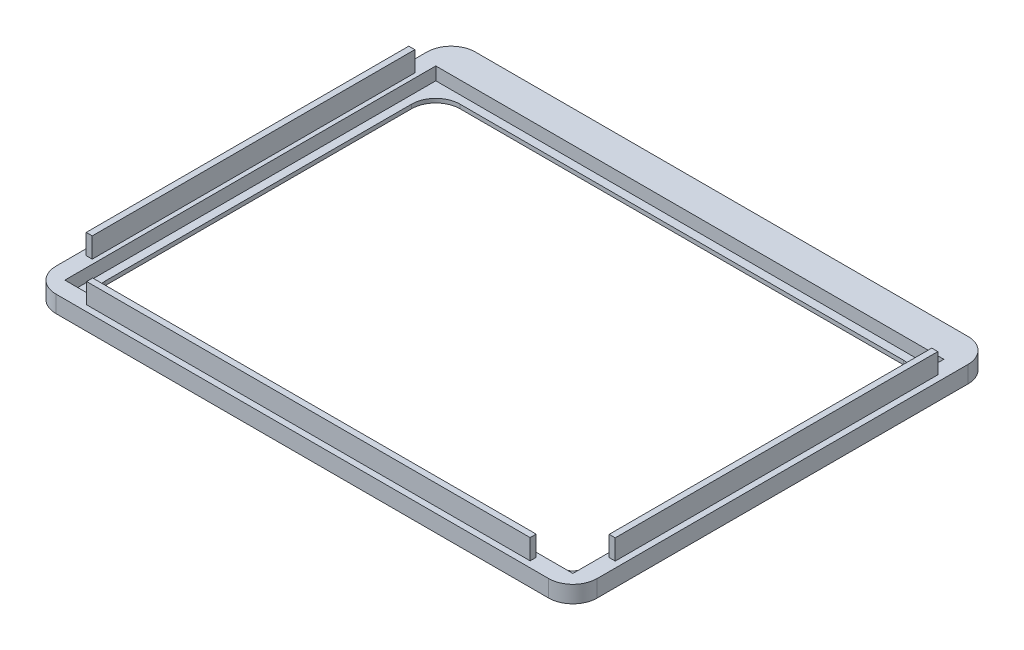
ISO-10303-21;
HEADER;
FILE_DESCRIPTION(('STEP AP214'),'2;1');
FILE_NAME('part.step','',(''),(''),'','','');
FILE_SCHEMA(('AUTOMOTIVE_DESIGN { 1 0 10303 214 1 1 1 1 }'));
ENDSEC;
DATA;
#1=APPLICATION_CONTEXT('core data for automotive mechanical design processes');
#2=APPLICATION_PROTOCOL_DEFINITION('international standard','automotive_design',2000,#1);
#3=PRODUCT_CONTEXT('',#1,'mechanical');
#4=PRODUCT('Part','Part','',(#3));
#5=PRODUCT_RELATED_PRODUCT_CATEGORY('part','',(#4));
#6=PRODUCT_DEFINITION_FORMATION('','',#4);
#7=PRODUCT_DEFINITION_CONTEXT('part definition',#1,'design');
#8=PRODUCT_DEFINITION('design','',#6,#7);
#9=PRODUCT_DEFINITION_SHAPE('','',#8);
#10=(LENGTH_UNIT() NAMED_UNIT(*) SI_UNIT(.MILLI.,.METRE.));
#11=(NAMED_UNIT(*) PLANE_ANGLE_UNIT() SI_UNIT($,.RADIAN.));
#12=(NAMED_UNIT(*) SI_UNIT($,.STERADIAN.) SOLID_ANGLE_UNIT());
#13=UNCERTAINTY_MEASURE_WITH_UNIT(LENGTH_MEASURE(1.E-05),#10,'distance_accuracy_value','');
#14=(GEOMETRIC_REPRESENTATION_CONTEXT(3) GLOBAL_UNCERTAINTY_ASSIGNED_CONTEXT((#13)) GLOBAL_UNIT_ASSIGNED_CONTEXT((#10,
#11,#12)) REPRESENTATION_CONTEXT('',''));
#15=CARTESIAN_POINT('',(0.,0.,0.));
#16=DIRECTION('',(0.,0.,1.));
#17=DIRECTION('',(1.,0.,0.));
#18=AXIS2_PLACEMENT_3D('',#15,#16,#17);
#19=CARTESIAN_POINT('',(3.,2.1,-49.));
#20=DIRECTION('',(0.,-1.,0.));
#21=DIRECTION('',(0.,0.,-1.));
#22=AXIS2_PLACEMENT_3D('',#19,#20,#21);
#23=PLANE('',#22);
#24=DIRECTION('',(0.,0.,1.));
#25=VECTOR('',#24,1.);
#26=CARTESIAN_POINT('',(65.6,2.1,-46.));
#27=LINE('',#26,#25);
#28=CARTESIAN_POINT('',(65.6,2.1,-46.));
#29=VERTEX_POINT('',#28);
#30=CARTESIAN_POINT('',(65.6,2.1,-6.));
#31=VERTEX_POINT('',#30);
#32=EDGE_CURVE('E319',#29,#31,#27,.T.);
#33=ORIENTED_EDGE('',*,*,#32,.F.);
#34=DIRECTION('',(-1.,0.,0.));
#35=VECTOR('',#34,1.);
#36=CARTESIAN_POINT('',(65.6,2.1,-46.));
#37=LINE('',#36,#35);
#38=CARTESIAN_POINT('',(66.35,2.1,-46.));
#39=VERTEX_POINT('',#38);
#40=EDGE_CURVE('E307',#39,#29,#37,.T.);
#41=ORIENTED_EDGE('',*,*,#40,.F.);
#42=DIRECTION('',(0.,0.,-1.));
#43=VECTOR('',#42,1.);
#44=CARTESIAN_POINT('',(66.35,2.1,-46.));
#45=LINE('',#44,#43);
#46=CARTESIAN_POINT('',(66.35,2.1,-6.));
#47=VERTEX_POINT('',#46);
#48=EDGE_CURVE('E313',#47,#39,#45,.T.);
#49=ORIENTED_EDGE('',*,*,#48,.F.);
#50=DIRECTION('',(1.,0.,0.));
#51=VECTOR('',#50,1.);
#52=CARTESIAN_POINT('',(65.6,2.1,-6.));
#53=LINE('',#52,#51);
#54=EDGE_CURVE('E316',#31,#47,#53,.T.);
#55=ORIENTED_EDGE('',*,*,#54,.F.);
#56=EDGE_LOOP('',(#33,#41,#49,#55));
#57=FACE_BOUND('',#56,.T.);
#58=CARTESIAN_POINT('',(3.,2.1,-49.));
#59=DIRECTION('',(0.,1.,0.));
#60=DIRECTION('',(0.,0.,-1.));
#61=AXIS2_PLACEMENT_3D('',#58,#59,#60);
#62=CIRCLE('',#61,3.);
#63=CARTESIAN_POINT('',(3.,2.1,-52.));
#64=VERTEX_POINT('',#63);
#65=CARTESIAN_POINT('',(0.,2.1,-49.));
#66=VERTEX_POINT('',#65);
#67=EDGE_CURVE('E503',#64,#66,#62,.T.);
#68=ORIENTED_EDGE('',*,*,#67,.T.);
#69=DIRECTION('',(0.,0.,1.));
#70=VECTOR('',#69,1.);
#71=CARTESIAN_POINT('',(0.,2.1,-3.));
#72=LINE('',#71,#70);
#73=CARTESIAN_POINT('',(0.,2.1,-3.));
#74=VERTEX_POINT('',#73);
#75=EDGE_CURVE('E509',#66,#74,#72,.T.);
#76=ORIENTED_EDGE('',*,*,#75,.T.);
#77=CARTESIAN_POINT('',(3.,2.1,-3.));
#78=DIRECTION('',(0.,1.,0.));
#79=DIRECTION('',(0.,0.,-1.));
#80=AXIS2_PLACEMENT_3D('',#77,#78,#79);
#81=CIRCLE('',#80,3.);
#82=CARTESIAN_POINT('',(3.,2.1,0.));
#83=VERTEX_POINT('',#82);
#84=EDGE_CURVE('E511',#74,#83,#81,.T.);
#85=ORIENTED_EDGE('',*,*,#84,.T.);
#86=DIRECTION('',(1.,0.,0.));
#87=VECTOR('',#86,1.);
#88=CARTESIAN_POINT('',(3.,2.1,0.));
#89=LINE('',#88,#87);
#90=CARTESIAN_POINT('',(64.1,2.1,0.));
#91=VERTEX_POINT('',#90);
#92=EDGE_CURVE('E517',#83,#91,#89,.T.);
#93=ORIENTED_EDGE('',*,*,#92,.T.);
#94=CARTESIAN_POINT('',(64.1,2.1,-3.));
#95=DIRECTION('',(0.,1.,0.));
#96=DIRECTION('',(0.,0.,1.));
#97=AXIS2_PLACEMENT_3D('',#94,#95,#96);
#98=CIRCLE('',#97,3.);
#99=CARTESIAN_POINT('',(67.1,2.1,-3.));
#100=VERTEX_POINT('',#99);
#101=EDGE_CURVE('E516',#91,#100,#98,.T.);
#102=ORIENTED_EDGE('',*,*,#101,.T.);
#103=DIRECTION('',(0.,0.,-1.));
#104=VECTOR('',#103,1.);
#105=CARTESIAN_POINT('',(67.1,2.1,-3.));
#106=LINE('',#105,#104);
#107=CARTESIAN_POINT('',(67.1,2.1,-49.));
#108=VERTEX_POINT('',#107);
#109=EDGE_CURVE('E525',#100,#108,#106,.T.);
#110=ORIENTED_EDGE('',*,*,#109,.T.);
#111=CARTESIAN_POINT('',(64.1,2.1,-49.));
#112=DIRECTION('',(0.,1.,0.));
#113=DIRECTION('',(0.,0.,-1.));
#114=AXIS2_PLACEMENT_3D('',#111,#112,#113);
#115=CIRCLE('',#114,3.00000000000001);
#116=CARTESIAN_POINT('',(64.1,2.1,-52.));
#117=VERTEX_POINT('',#116);
#118=EDGE_CURVE('E521',#108,#117,#115,.T.);
#119=ORIENTED_EDGE('',*,*,#118,.T.);
#120=DIRECTION('',(-1.,0.,0.));
#121=VECTOR('',#120,1.);
#122=CARTESIAN_POINT('',(3.,2.1,-52.));
#123=LINE('',#122,#121);
#124=EDGE_CURVE('E526',#117,#64,#123,.T.);
#125=ORIENTED_EDGE('',*,*,#124,.T.);
#126=EDGE_LOOP('',(#68,#76,#85,#93,#102,#110,#119,#125));
#127=FACE_BOUND('',#126,.T.);
#128=DIRECTION('',(1.,0.,0.));
#129=VECTOR('',#128,1.);
#130=CARTESIAN_POINT('',(2.05,2.1,-2.05));
#131=LINE('',#130,#129);
#132=CARTESIAN_POINT('',(2.05,2.1,-2.05));
#133=VERTEX_POINT('',#132);
#134=CARTESIAN_POINT('',(65.05,2.1,-2.05));
#135=VERTEX_POINT('',#134);
#136=EDGE_CURVE('E481',#133,#135,#131,.T.);
#137=ORIENTED_EDGE('',*,*,#136,.F.);
#138=DIRECTION('',(0.,0.,1.));
#139=VECTOR('',#138,1.);
#140=CARTESIAN_POINT('',(2.05,2.1,-2.05));
#141=LINE('',#140,#139);
#142=CARTESIAN_POINT('',(2.05,2.1,-48.05));
#143=VERTEX_POINT('',#142);
#144=EDGE_CURVE('E438',#143,#133,#141,.T.);
#145=ORIENTED_EDGE('',*,*,#144,.F.);
#146=DIRECTION('',(-1.,0.,0.));
#147=VECTOR('',#146,1.);
#148=CARTESIAN_POINT('',(2.05,2.1,-48.05));
#149=LINE('',#148,#147);
#150=CARTESIAN_POINT('',(65.05,2.1,-48.05));
#151=VERTEX_POINT('',#150);
#152=EDGE_CURVE('E467',#151,#143,#149,.T.);
#153=ORIENTED_EDGE('',*,*,#152,.F.);
#154=DIRECTION('',(0.,0.,-1.));
#155=VECTOR('',#154,1.);
#156=CARTESIAN_POINT('',(65.05,2.1,-2.05));
#157=LINE('',#156,#155);
#158=EDGE_CURVE('E484',#135,#151,#157,.T.);
#159=ORIENTED_EDGE('',*,*,#158,.F.);
#160=EDGE_LOOP('',(#137,#145,#153,#159));
#161=FACE_BOUND('',#160,.T.);
#162=DIRECTION('',(0.,0.,1.));
#163=VECTOR('',#162,1.);
#164=CARTESIAN_POINT('',(6.05,2.1,-1.5));
#165=LINE('',#164,#163);
#166=CARTESIAN_POINT('',(6.05,2.1,-1.5));
#167=VERTEX_POINT('',#166);
#168=CARTESIAN_POINT('',(6.05,2.1,-0.75));
#169=VERTEX_POINT('',#168);
#170=EDGE_CURVE('E294',#167,#169,#165,.T.);
#171=ORIENTED_EDGE('',*,*,#170,.F.);
#172=DIRECTION('',(-1.,0.,0.));
#173=VECTOR('',#172,1.);
#174=CARTESIAN_POINT('',(6.05,2.1,-1.5));
#175=LINE('',#174,#173);
#176=CARTESIAN_POINT('',(61.05,2.1,-1.5));
#177=VERTEX_POINT('',#176);
#178=EDGE_CURVE('E354',#177,#167,#175,.T.);
#179=ORIENTED_EDGE('',*,*,#178,.F.);
#180=DIRECTION('',(0.,0.,-1.));
#181=VECTOR('',#180,1.);
#182=CARTESIAN_POINT('',(61.05,2.1,-1.5));
#183=LINE('',#182,#181);
#184=CARTESIAN_POINT('',(61.05,2.1,-0.75));
#185=VERTEX_POINT('',#184);
#186=EDGE_CURVE('E357',#185,#177,#183,.T.);
#187=ORIENTED_EDGE('',*,*,#186,.F.);
#188=DIRECTION('',(1.,0.,0.));
#189=VECTOR('',#188,1.);
#190=CARTESIAN_POINT('',(6.05,2.1,-0.75));
#191=LINE('',#190,#189);
#192=EDGE_CURVE('E363',#169,#185,#191,.T.);
#193=ORIENTED_EDGE('',*,*,#192,.F.);
#194=EDGE_LOOP('',(#171,#179,#187,#193));
#195=FACE_BOUND('',#194,.T.);
#196=DIRECTION('',(0.,0.,1.));
#197=VECTOR('',#196,1.);
#198=CARTESIAN_POINT('',(0.750000000000005,2.1,-46.));
#199=LINE('',#198,#197);
#200=CARTESIAN_POINT('',(0.750000000000005,2.1,-46.));
#201=VERTEX_POINT('',#200);
#202=CARTESIAN_POINT('',(0.750000000000005,2.1,-6.));
#203=VERTEX_POINT('',#202);
#204=EDGE_CURVE('E62',#201,#203,#199,.T.);
#205=ORIENTED_EDGE('',*,*,#204,.F.);
#206=DIRECTION('',(-1.,0.,0.));
#207=VECTOR('',#206,1.);
#208=CARTESIAN_POINT('',(0.750000000000005,2.1,-46.));
#209=LINE('',#208,#207);
#210=CARTESIAN_POINT('',(1.50000000000001,2.1,-46.));
#211=VERTEX_POINT('',#210);
#212=EDGE_CURVE('E63',#211,#201,#209,.T.);
#213=ORIENTED_EDGE('',*,*,#212,.F.);
#214=DIRECTION('',(0.,0.,-1.));
#215=VECTOR('',#214,1.);
#216=CARTESIAN_POINT('',(1.50000000000001,2.1,-46.));
#217=LINE('',#216,#215);
#218=CARTESIAN_POINT('',(1.50000000000001,2.1,-6.));
#219=VERTEX_POINT('',#218);
#220=EDGE_CURVE('E919',#219,#211,#217,.T.);
#221=ORIENTED_EDGE('',*,*,#220,.F.);
#222=DIRECTION('',(1.,0.,0.));
#223=VECTOR('',#222,1.);
#224=CARTESIAN_POINT('',(0.750000000000005,2.1,-6.));
#225=LINE('',#224,#223);
#226=EDGE_CURVE('E927',#203,#219,#225,.T.);
#227=ORIENTED_EDGE('',*,*,#226,.F.);
#228=EDGE_LOOP('',(#205,#213,#221,#227));
#229=FACE_BOUND('',#228,.T.);
#230=ADVANCED_FACE('F44',(#57,#127,#161,#195,#229),#23,.F.);
#231=CARTESIAN_POINT('',(0.,0.5,0.));
#232=DIRECTION('',(0.,-1.,0.));
#233=DIRECTION('',(0.,0.,-1.));
#234=AXIS2_PLACEMENT_3D('',#231,#232,#233);
#235=PLANE('',#234);
#236=DIRECTION('',(0.,0.,1.));
#237=VECTOR('',#236,1.);
#238=CARTESIAN_POINT('',(2.05,0.5,-2.05));
#239=LINE('',#238,#237);
#240=CARTESIAN_POINT('',(2.05,0.5,-48.05));
#241=VERTEX_POINT('',#240);
#242=CARTESIAN_POINT('',(2.05,0.5,-2.05));
#243=VERTEX_POINT('',#242);
#244=EDGE_CURVE('E462',#241,#243,#239,.T.);
#245=ORIENTED_EDGE('',*,*,#244,.T.);
#246=DIRECTION('',(1.,0.,0.));
#247=VECTOR('',#246,1.);
#248=CARTESIAN_POINT('',(2.05,0.5,-2.05));
#249=LINE('',#248,#247);
#250=CARTESIAN_POINT('',(65.05,0.5,-2.05));
#251=VERTEX_POINT('',#250);
#252=EDGE_CURVE('E463',#243,#251,#249,.T.);
#253=ORIENTED_EDGE('',*,*,#252,.T.);
#254=DIRECTION('',(0.,0.,-1.));
#255=VECTOR('',#254,1.);
#256=CARTESIAN_POINT('',(65.05,0.5,-2.05));
#257=LINE('',#256,#255);
#258=CARTESIAN_POINT('',(65.05,0.5,-48.05));
#259=VERTEX_POINT('',#258);
#260=EDGE_CURVE('E466',#251,#259,#257,.T.);
#261=ORIENTED_EDGE('',*,*,#260,.T.);
#262=DIRECTION('',(-1.,0.,0.));
#263=VECTOR('',#262,1.);
#264=CARTESIAN_POINT('',(2.05,0.5,-48.05));
#265=LINE('',#264,#263);
#266=EDGE_CURVE('E475',#259,#241,#265,.T.);
#267=ORIENTED_EDGE('',*,*,#266,.T.);
#268=EDGE_LOOP('',(#245,#253,#261,#267));
#269=FACE_BOUND('',#268,.T.);
#270=CARTESIAN_POINT('',(6.05,0.5,-44.05));
#271=DIRECTION('',(0.,1.,0.));
#272=DIRECTION('',(0.,0.,1.));
#273=AXIS2_PLACEMENT_3D('',#270,#271,#272);
#274=CIRCLE('',#273,3.);
#275=CARTESIAN_POINT('',(6.05,0.5,-47.05));
#276=VERTEX_POINT('',#275);
#277=CARTESIAN_POINT('',(3.05,0.5,-44.05));
#278=VERTEX_POINT('',#277);
#279=EDGE_CURVE('E279',#276,#278,#274,.T.);
#280=ORIENTED_EDGE('',*,*,#279,.F.);
#281=DIRECTION('',(1.,0.,0.));
#282=VECTOR('',#281,1.);
#283=CARTESIAN_POINT('',(6.05,0.5,-47.05));
#284=LINE('',#283,#282);
#285=CARTESIAN_POINT('',(61.05,0.5,-47.05));
#286=VERTEX_POINT('',#285);
#287=EDGE_CURVE('E383',#276,#286,#284,.T.);
#288=ORIENTED_EDGE('',*,*,#287,.T.);
#289=CARTESIAN_POINT('',(61.05,0.5,-44.05));
#290=DIRECTION('',(0.,-1.,0.));
#291=DIRECTION('',(0.,0.,-1.));
#292=AXIS2_PLACEMENT_3D('',#289,#290,#291);
#293=CIRCLE('',#292,3.);
#294=CARTESIAN_POINT('',(64.05,0.5,-44.05));
#295=VERTEX_POINT('',#294);
#296=EDGE_CURVE('E427',#286,#295,#293,.T.);
#297=ORIENTED_EDGE('',*,*,#296,.T.);
#298=DIRECTION('',(0.,0.,1.));
#299=VECTOR('',#298,1.);
#300=CARTESIAN_POINT('',(64.05,0.5,-44.05));
#301=LINE('',#300,#299);
#302=CARTESIAN_POINT('',(64.05,0.5,-6.05));
#303=VERTEX_POINT('',#302);
#304=EDGE_CURVE('E422',#295,#303,#301,.T.);
#305=ORIENTED_EDGE('',*,*,#304,.T.);
#306=CARTESIAN_POINT('',(61.05,0.5,-6.05));
#307=DIRECTION('',(0.,1.,0.));
#308=DIRECTION('',(0.,0.,1.));
#309=AXIS2_PLACEMENT_3D('',#306,#307,#308);
#310=CIRCLE('',#309,3.);
#311=CARTESIAN_POINT('',(61.05,0.5,-3.05000000000001));
#312=VERTEX_POINT('',#311);
#313=EDGE_CURVE('E423',#312,#303,#310,.T.);
#314=ORIENTED_EDGE('',*,*,#313,.F.);
#315=DIRECTION('',(1.,0.,0.));
#316=VECTOR('',#315,1.);
#317=CARTESIAN_POINT('',(6.05,0.5,-3.05));
#318=LINE('',#317,#316);
#319=CARTESIAN_POINT('',(6.05,0.5,-3.05));
#320=VERTEX_POINT('',#319);
#321=EDGE_CURVE('E417',#320,#312,#318,.T.);
#322=ORIENTED_EDGE('',*,*,#321,.F.);
#323=CARTESIAN_POINT('',(6.05,0.5,-6.05));
#324=DIRECTION('',(0.,1.,0.));
#325=DIRECTION('',(0.,0.,1.));
#326=AXIS2_PLACEMENT_3D('',#323,#324,#325);
#327=CIRCLE('',#326,3.);
#328=CARTESIAN_POINT('',(3.05,0.5,-6.05));
#329=VERTEX_POINT('',#328);
#330=EDGE_CURVE('E413',#329,#320,#327,.T.);
#331=ORIENTED_EDGE('',*,*,#330,.F.);
#332=DIRECTION('',(0.,0.,1.));
#333=VECTOR('',#332,1.);
#334=CARTESIAN_POINT('',(3.05,0.5,-44.05));
#335=LINE('',#334,#333);
#336=EDGE_CURVE('E285',#278,#329,#335,.T.);
#337=ORIENTED_EDGE('',*,*,#336,.F.);
#338=EDGE_LOOP('',(#280,#288,#297,#305,#314,#322,#331,#337));
#339=FACE_BOUND('',#338,.T.);
#340=ADVANCED_FACE('F626',(#269,#339),#235,.F.);
#341=CARTESIAN_POINT('',(3.,2.1,-49.));
#342=DIRECTION('',(0.,-1.,0.));
#343=DIRECTION('',(0.,0.,-1.));
#344=AXIS2_PLACEMENT_3D('',#341,#342,#343);
#345=CYLINDRICAL_SURFACE('',#344,3.);
#346=CARTESIAN_POINT('',(3.,0.,-49.));
#347=DIRECTION('',(0.,1.,0.));
#348=DIRECTION('',(0.,0.,-1.));
#349=AXIS2_PLACEMENT_3D('',#346,#347,#348);
#350=CIRCLE('',#349,3.);
#351=CARTESIAN_POINT('',(3.,0.,-52.));
#352=VERTEX_POINT('',#351);
#353=CARTESIAN_POINT('',(0.,0.,-49.));
#354=VERTEX_POINT('',#353);
#355=EDGE_CURVE('E494',#352,#354,#350,.T.);
#356=ORIENTED_EDGE('',*,*,#355,.T.);
#357=DIRECTION('',(0.,-1.,0.));
#358=VECTOR('',#357,1.);
#359=CARTESIAN_POINT('',(0.,2.1,-49.));
#360=LINE('',#359,#358);
#361=EDGE_CURVE('E11',#66,#354,#360,.T.);
#362=ORIENTED_EDGE('',*,*,#361,.F.);
#363=ORIENTED_EDGE('',*,*,#67,.F.);
#364=DIRECTION('',(0.,-1.,0.));
#365=VECTOR('',#364,1.);
#366=CARTESIAN_POINT('',(3.,2.1,-52.));
#367=LINE('',#366,#365);
#368=EDGE_CURVE('E533',#64,#352,#367,.T.);
#369=ORIENTED_EDGE('',*,*,#368,.T.);
#370=EDGE_LOOP('',(#356,#362,#363,#369));
#371=FACE_BOUND('',#370,.T.);
#372=ADVANCED_FACE('F50',(#371),#345,.T.);
#373=CARTESIAN_POINT('',(0.,2.1,-3.));
#374=DIRECTION('',(1.,0.,0.));
#375=DIRECTION('',(0.,0.,-1.));
#376=AXIS2_PLACEMENT_3D('',#373,#374,#375);
#377=PLANE('',#376);
#378=DIRECTION('',(0.,0.,1.));
#379=VECTOR('',#378,1.);
#380=CARTESIAN_POINT('',(0.,0.,-3.));
#381=LINE('',#380,#379);
#382=CARTESIAN_POINT('',(0.,0.,-3.));
#383=VERTEX_POINT('',#382);
#384=EDGE_CURVE('E532',#354,#383,#381,.T.);
#385=ORIENTED_EDGE('',*,*,#384,.T.);
#386=DIRECTION('',(0.,-1.,0.));
#387=VECTOR('',#386,1.);
#388=CARTESIAN_POINT('',(0.,2.1,-3.));
#389=LINE('',#388,#387);
#390=EDGE_CURVE('E53',#74,#383,#389,.T.);
#391=ORIENTED_EDGE('',*,*,#390,.F.);
#392=ORIENTED_EDGE('',*,*,#75,.F.);
#393=ORIENTED_EDGE('',*,*,#361,.T.);
#394=EDGE_LOOP('',(#385,#391,#392,#393));
#395=FACE_BOUND('',#394,.T.);
#396=ADVANCED_FACE('F607',(#395),#377,.F.);
#397=CARTESIAN_POINT('',(3.,2.1,-3.));
#398=DIRECTION('',(0.,-1.,0.));
#399=DIRECTION('',(0.,0.,-1.));
#400=AXIS2_PLACEMENT_3D('',#397,#398,#399);
#401=CYLINDRICAL_SURFACE('',#400,3.);
#402=CARTESIAN_POINT('',(3.,0.,-3.));
#403=DIRECTION('',(0.,1.,0.));
#404=DIRECTION('',(0.,0.,-1.));
#405=AXIS2_PLACEMENT_3D('',#402,#403,#404);
#406=CIRCLE('',#405,3.);
#407=CARTESIAN_POINT('',(3.,0.,0.));
#408=VERTEX_POINT('',#407);
#409=EDGE_CURVE('E538',#383,#408,#406,.T.);
#410=ORIENTED_EDGE('',*,*,#409,.T.);
#411=DIRECTION('',(0.,-1.,0.));
#412=VECTOR('',#411,1.);
#413=CARTESIAN_POINT('',(3.,2.1,0.));
#414=LINE('',#413,#412);
#415=EDGE_CURVE('E571',#83,#408,#414,.T.);
#416=ORIENTED_EDGE('',*,*,#415,.F.);
#417=ORIENTED_EDGE('',*,*,#84,.F.);
#418=ORIENTED_EDGE('',*,*,#390,.T.);
#419=EDGE_LOOP('',(#410,#416,#417,#418));
#420=FACE_BOUND('',#419,.T.);
#421=ADVANCED_FACE('F581',(#420),#401,.T.);
#422=CARTESIAN_POINT('',(3.,2.1,0.));
#423=DIRECTION('',(0.,0.,-1.));
#424=DIRECTION('',(-1.,0.,0.));
#425=AXIS2_PLACEMENT_3D('',#422,#423,#424);
#426=PLANE('',#425);
#427=DIRECTION('',(1.,0.,0.));
#428=VECTOR('',#427,1.);
#429=CARTESIAN_POINT('',(3.,0.,0.));
#430=LINE('',#429,#428);
#431=CARTESIAN_POINT('',(64.1,0.,0.));
#432=VERTEX_POINT('',#431);
#433=EDGE_CURVE('E541',#408,#432,#430,.T.);
#434=ORIENTED_EDGE('',*,*,#433,.T.);
#435=DIRECTION('',(0.,-1.,0.));
#436=VECTOR('',#435,1.);
#437=CARTESIAN_POINT('',(64.1,2.1,0.));
#438=LINE('',#437,#436);
#439=EDGE_CURVE('E568',#91,#432,#438,.T.);
#440=ORIENTED_EDGE('',*,*,#439,.F.);
#441=ORIENTED_EDGE('',*,*,#92,.F.);
#442=ORIENTED_EDGE('',*,*,#415,.T.);
#443=EDGE_LOOP('',(#434,#440,#441,#442));
#444=FACE_BOUND('',#443,.T.);
#445=ADVANCED_FACE('F592',(#444),#426,.F.);
#446=CARTESIAN_POINT('',(64.1,2.1,-3.));
#447=DIRECTION('',(0.,-1.,0.));
#448=DIRECTION('',(0.,0.,-1.));
#449=AXIS2_PLACEMENT_3D('',#446,#447,#448);
#450=CYLINDRICAL_SURFACE('',#449,3.);
#451=CARTESIAN_POINT('',(64.1,0.,-3.));
#452=DIRECTION('',(0.,1.,0.));
#453=DIRECTION('',(0.,0.,1.));
#454=AXIS2_PLACEMENT_3D('',#451,#452,#453);
#455=CIRCLE('',#454,3.);
#456=CARTESIAN_POINT('',(67.1,0.,-3.));
#457=VERTEX_POINT('',#456);
#458=EDGE_CURVE('E542',#432,#457,#455,.T.);
#459=ORIENTED_EDGE('',*,*,#458,.T.);
#460=DIRECTION('',(0.,-1.,0.));
#461=VECTOR('',#460,1.);
#462=CARTESIAN_POINT('',(67.1,2.1,-3.));
#463=LINE('',#462,#461);
#464=EDGE_CURVE('E567',#100,#457,#463,.T.);
#465=ORIENTED_EDGE('',*,*,#464,.F.);
#466=ORIENTED_EDGE('',*,*,#101,.F.);
#467=ORIENTED_EDGE('',*,*,#439,.T.);
#468=EDGE_LOOP('',(#459,#465,#466,#467));
#469=FACE_BOUND('',#468,.T.);
#470=ADVANCED_FACE('F598',(#469),#450,.T.);
#471=CARTESIAN_POINT('',(67.1,2.1,-3.));
#472=DIRECTION('',(-1.,0.,0.));
#473=DIRECTION('',(0.,0.,1.));
#474=AXIS2_PLACEMENT_3D('',#471,#472,#473);
#475=PLANE('',#474);
#476=DIRECTION('',(0.,0.,-1.));
#477=VECTOR('',#476,1.);
#478=CARTESIAN_POINT('',(67.1,0.,-3.));
#479=LINE('',#478,#477);
#480=CARTESIAN_POINT('',(67.1,0.,-49.));
#481=VERTEX_POINT('',#480);
#482=EDGE_CURVE('E550',#457,#481,#479,.T.);
#483=ORIENTED_EDGE('',*,*,#482,.T.);
#484=DIRECTION('',(0.,-1.,0.));
#485=VECTOR('',#484,1.);
#486=CARTESIAN_POINT('',(67.1,2.1,-49.));
#487=LINE('',#486,#485);
#488=EDGE_CURVE('E565',#108,#481,#487,.T.);
#489=ORIENTED_EDGE('',*,*,#488,.F.);
#490=ORIENTED_EDGE('',*,*,#109,.F.);
#491=ORIENTED_EDGE('',*,*,#464,.T.);
#492=EDGE_LOOP('',(#483,#489,#490,#491));
#493=FACE_BOUND('',#492,.T.);
#494=ADVANCED_FACE('F619',(#493),#475,.F.);
#495=CARTESIAN_POINT('',(64.1,2.1,-49.));
#496=DIRECTION('',(0.,-1.,0.));
#497=DIRECTION('',(0.,0.,-1.));
#498=AXIS2_PLACEMENT_3D('',#495,#496,#497);
#499=CYLINDRICAL_SURFACE('',#498,3.00000000000001);
#500=CARTESIAN_POINT('',(64.1,0.,-49.));
#501=DIRECTION('',(0.,1.,0.));
#502=DIRECTION('',(0.,0.,-1.));
#503=AXIS2_PLACEMENT_3D('',#500,#501,#502);
#504=CIRCLE('',#503,3.00000000000001);
#505=CARTESIAN_POINT('',(64.1,0.,-52.));
#506=VERTEX_POINT('',#505);
#507=EDGE_CURVE('E549',#481,#506,#504,.T.);
#508=ORIENTED_EDGE('',*,*,#507,.T.);
#509=DIRECTION('',(0.,-1.,0.));
#510=VECTOR('',#509,1.);
#511=CARTESIAN_POINT('',(64.1,2.1,-52.));
#512=LINE('',#511,#510);
#513=EDGE_CURVE('E560',#117,#506,#512,.T.);
#514=ORIENTED_EDGE('',*,*,#513,.F.);
#515=ORIENTED_EDGE('',*,*,#118,.F.);
#516=ORIENTED_EDGE('',*,*,#488,.T.);
#517=EDGE_LOOP('',(#508,#514,#515,#516));
#518=FACE_BOUND('',#517,.T.);
#519=ADVANCED_FACE('F620',(#518),#499,.T.);
#520=CARTESIAN_POINT('',(3.,2.1,-52.));
#521=DIRECTION('',(0.,0.,1.));
#522=DIRECTION('',(1.,0.,0.));
#523=AXIS2_PLACEMENT_3D('',#520,#521,#522);
#524=PLANE('',#523);
#525=DIRECTION('',(-1.,0.,0.));
#526=VECTOR('',#525,1.);
#527=CARTESIAN_POINT('',(3.,0.,-52.));
#528=LINE('',#527,#526);
#529=EDGE_CURVE('E506',#506,#352,#528,.T.);
#530=ORIENTED_EDGE('',*,*,#529,.T.);
#531=ORIENTED_EDGE('',*,*,#368,.F.);
#532=ORIENTED_EDGE('',*,*,#124,.F.);
#533=ORIENTED_EDGE('',*,*,#513,.T.);
#534=EDGE_LOOP('',(#530,#531,#532,#533));
#535=FACE_BOUND('',#534,.T.);
#536=ADVANCED_FACE('F614',(#535),#524,.F.);
#537=CARTESIAN_POINT('',(3.,0.,-49.));
#538=DIRECTION('',(0.,-1.,0.));
#539=DIRECTION('',(0.,0.,-1.));
#540=AXIS2_PLACEMENT_3D('',#537,#538,#539);
#541=PLANE('',#540);
#542=CARTESIAN_POINT('',(6.05,0.,-44.05));
#543=DIRECTION('',(0.,1.,0.));
#544=DIRECTION('',(0.,0.,1.));
#545=AXIS2_PLACEMENT_3D('',#542,#543,#544);
#546=CIRCLE('',#545,3.);
#547=CARTESIAN_POINT('',(6.05,0.,-47.05));
#548=VERTEX_POINT('',#547);
#549=CARTESIAN_POINT('',(3.05,0.,-44.05));
#550=VERTEX_POINT('',#549);
#551=EDGE_CURVE('E377',#548,#550,#546,.T.);
#552=ORIENTED_EDGE('',*,*,#551,.T.);
#553=DIRECTION('',(0.,0.,1.));
#554=VECTOR('',#553,1.);
#555=CARTESIAN_POINT('',(3.05,0.,-44.05));
#556=LINE('',#555,#554);
#557=CARTESIAN_POINT('',(3.05,0.,-6.05000000000001));
#558=VERTEX_POINT('',#557);
#559=EDGE_CURVE('E382',#550,#558,#556,.T.);
#560=ORIENTED_EDGE('',*,*,#559,.T.);
#561=CARTESIAN_POINT('',(6.05,0.,-6.05));
#562=DIRECTION('',(0.,1.,0.));
#563=DIRECTION('',(0.,0.,1.));
#564=AXIS2_PLACEMENT_3D('',#561,#562,#563);
#565=CIRCLE('',#564,3.);
#566=CARTESIAN_POINT('',(6.05,0.,-3.05));
#567=VERTEX_POINT('',#566);
#568=EDGE_CURVE('E389',#558,#567,#565,.T.);
#569=ORIENTED_EDGE('',*,*,#568,.T.);
#570=DIRECTION('',(1.,0.,0.));
#571=VECTOR('',#570,1.);
#572=CARTESIAN_POINT('',(6.05,0.,-3.05));
#573=LINE('',#572,#571);
#574=CARTESIAN_POINT('',(61.05,0.,-3.05000000000001));
#575=VERTEX_POINT('',#574);
#576=EDGE_CURVE('E394',#567,#575,#573,.T.);
#577=ORIENTED_EDGE('',*,*,#576,.T.);
#578=CARTESIAN_POINT('',(61.05,0.,-6.05));
#579=DIRECTION('',(0.,1.,0.));
#580=DIRECTION('',(0.,0.,1.));
#581=AXIS2_PLACEMENT_3D('',#578,#579,#580);
#582=CIRCLE('',#581,3.);
#583=CARTESIAN_POINT('',(64.05,0.,-6.05));
#584=VERTEX_POINT('',#583);
#585=EDGE_CURVE('E397',#575,#584,#582,.T.);
#586=ORIENTED_EDGE('',*,*,#585,.T.);
#587=DIRECTION('',(0.,0.,1.));
#588=VECTOR('',#587,1.);
#589=CARTESIAN_POINT('',(64.05,0.,-44.05));
#590=LINE('',#589,#588);
#591=CARTESIAN_POINT('',(64.05,0.,-44.05));
#592=VERTEX_POINT('',#591);
#593=EDGE_CURVE('E396',#592,#584,#590,.T.);
#594=ORIENTED_EDGE('',*,*,#593,.F.);
#595=CARTESIAN_POINT('',(61.05,0.,-44.05));
#596=DIRECTION('',(0.,-1.,0.));
#597=DIRECTION('',(0.,0.,-1.));
#598=AXIS2_PLACEMENT_3D('',#595,#596,#597);
#599=CIRCLE('',#598,3.);
#600=CARTESIAN_POINT('',(61.05,0.,-47.05));
#601=VERTEX_POINT('',#600);
#602=EDGE_CURVE('E401',#601,#592,#599,.T.);
#603=ORIENTED_EDGE('',*,*,#602,.F.);
#604=DIRECTION('',(1.,0.,0.));
#605=VECTOR('',#604,1.);
#606=CARTESIAN_POINT('',(6.05,0.,-47.05));
#607=LINE('',#606,#605);
#608=EDGE_CURVE('E407',#548,#601,#607,.T.);
#609=ORIENTED_EDGE('',*,*,#608,.F.);
#610=EDGE_LOOP('',(#552,#560,#569,#577,#586,#594,#603,#609));
#611=FACE_BOUND('',#610,.T.);
#612=ORIENTED_EDGE('',*,*,#355,.F.);
#613=ORIENTED_EDGE('',*,*,#529,.F.);
#614=ORIENTED_EDGE('',*,*,#507,.F.);
#615=ORIENTED_EDGE('',*,*,#482,.F.);
#616=ORIENTED_EDGE('',*,*,#458,.F.);
#617=ORIENTED_EDGE('',*,*,#433,.F.);
#618=ORIENTED_EDGE('',*,*,#409,.F.);
#619=ORIENTED_EDGE('',*,*,#384,.F.);
#620=EDGE_LOOP('',(#612,#613,#614,#615,#616,#617,#618,#619));
#621=FACE_BOUND('',#620,.T.);
#622=ADVANCED_FACE('F589',(#611,#621),#541,.T.);
#623=CARTESIAN_POINT('',(2.05,0.5,-2.05));
#624=DIRECTION('',(-1.,0.,0.));
#625=DIRECTION('',(0.,0.,1.));
#626=AXIS2_PLACEMENT_3D('',#623,#624,#625);
#627=PLANE('',#626);
#628=ORIENTED_EDGE('',*,*,#144,.T.);
#629=DIRECTION('',(0.,1.,0.));
#630=VECTOR('',#629,1.);
#631=CARTESIAN_POINT('',(2.05,0.5,-2.05));
#632=LINE('',#631,#630);
#633=EDGE_CURVE('E476',#243,#133,#632,.T.);
#634=ORIENTED_EDGE('',*,*,#633,.F.);
#635=ORIENTED_EDGE('',*,*,#244,.F.);
#636=DIRECTION('',(0.,1.,0.));
#637=VECTOR('',#636,1.);
#638=CARTESIAN_POINT('',(2.05,0.5,-48.05));
#639=LINE('',#638,#637);
#640=EDGE_CURVE('E495',#241,#143,#639,.T.);
#641=ORIENTED_EDGE('',*,*,#640,.T.);
#642=EDGE_LOOP('',(#628,#634,#635,#641));
#643=FACE_BOUND('',#642,.T.);
#644=ADVANCED_FACE('F643',(#643),#627,.F.);
#645=CARTESIAN_POINT('',(2.05,0.5,-48.05));
#646=DIRECTION('',(0.,0.,-1.));
#647=DIRECTION('',(-1.,0.,0.));
#648=AXIS2_PLACEMENT_3D('',#645,#646,#647);
#649=PLANE('',#648);
#650=ORIENTED_EDGE('',*,*,#152,.T.);
#651=ORIENTED_EDGE('',*,*,#640,.F.);
#652=ORIENTED_EDGE('',*,*,#266,.F.);
#653=DIRECTION('',(0.,1.,0.));
#654=VECTOR('',#653,1.);
#655=CARTESIAN_POINT('',(65.05,0.5,-48.05));
#656=LINE('',#655,#654);
#657=EDGE_CURVE('E497',#259,#151,#656,.T.);
#658=ORIENTED_EDGE('',*,*,#657,.T.);
#659=EDGE_LOOP('',(#650,#651,#652,#658));
#660=FACE_BOUND('',#659,.T.);
#661=ADVANCED_FACE('F658',(#660),#649,.F.);
#662=CARTESIAN_POINT('',(65.05,0.5,-2.05));
#663=DIRECTION('',(1.,0.,0.));
#664=DIRECTION('',(0.,0.,-1.));
#665=AXIS2_PLACEMENT_3D('',#662,#663,#664);
#666=PLANE('',#665);
#667=ORIENTED_EDGE('',*,*,#158,.T.);
#668=ORIENTED_EDGE('',*,*,#657,.F.);
#669=ORIENTED_EDGE('',*,*,#260,.F.);
#670=DIRECTION('',(0.,1.,0.));
#671=VECTOR('',#670,1.);
#672=CARTESIAN_POINT('',(65.05,0.5,-2.05));
#673=LINE('',#672,#671);
#674=EDGE_CURVE('E496',#251,#135,#673,.T.);
#675=ORIENTED_EDGE('',*,*,#674,.T.);
#676=EDGE_LOOP('',(#667,#668,#669,#675));
#677=FACE_BOUND('',#676,.T.);
#678=ADVANCED_FACE('F669',(#677),#666,.F.);
#679=CARTESIAN_POINT('',(2.05,0.5,-2.05));
#680=DIRECTION('',(0.,0.,1.));
#681=DIRECTION('',(1.,0.,0.));
#682=AXIS2_PLACEMENT_3D('',#679,#680,#681);
#683=PLANE('',#682);
#684=ORIENTED_EDGE('',*,*,#136,.T.);
#685=ORIENTED_EDGE('',*,*,#674,.F.);
#686=ORIENTED_EDGE('',*,*,#252,.F.);
#687=ORIENTED_EDGE('',*,*,#633,.T.);
#688=EDGE_LOOP('',(#684,#685,#686,#687));
#689=FACE_BOUND('',#688,.T.);
#690=ADVANCED_FACE('F677',(#689),#683,.F.);
#691=CARTESIAN_POINT('',(6.05,0.,-44.05));
#692=DIRECTION('',(0.,1.,0.));
#693=DIRECTION('',(0.,0.,1.));
#694=AXIS2_PLACEMENT_3D('',#691,#692,#693);
#695=CYLINDRICAL_SURFACE('',#694,3.);
#696=ORIENTED_EDGE('',*,*,#279,.T.);
#697=DIRECTION('',(0.,1.,0.));
#698=VECTOR('',#697,1.);
#699=CARTESIAN_POINT('',(3.05,0.,-44.05));
#700=LINE('',#699,#698);
#701=EDGE_CURVE('E410',#550,#278,#700,.T.);
#702=ORIENTED_EDGE('',*,*,#701,.F.);
#703=ORIENTED_EDGE('',*,*,#551,.F.);
#704=DIRECTION('',(0.,1.,0.));
#705=VECTOR('',#704,1.);
#706=CARTESIAN_POINT('',(6.05,0.,-47.05));
#707=LINE('',#706,#705);
#708=EDGE_CURVE('E436',#548,#276,#707,.T.);
#709=ORIENTED_EDGE('',*,*,#708,.T.);
#710=EDGE_LOOP('',(#696,#702,#703,#709));
#711=FACE_BOUND('',#710,.T.);
#712=ADVANCED_FACE('F681',(#711),#695,.F.);
#713=CARTESIAN_POINT('',(6.05,0.,-47.05));
#714=DIRECTION('',(0.,0.,1.));
#715=DIRECTION('',(1.,0.,0.));
#716=AXIS2_PLACEMENT_3D('',#713,#714,#715);
#717=PLANE('',#716);
#718=ORIENTED_EDGE('',*,*,#287,.F.);
#719=ORIENTED_EDGE('',*,*,#708,.F.);
#720=ORIENTED_EDGE('',*,*,#608,.T.);
#721=DIRECTION('',(0.,1.,0.));
#722=VECTOR('',#721,1.);
#723=CARTESIAN_POINT('',(61.05,0.,-47.05));
#724=LINE('',#723,#722);
#725=EDGE_CURVE('E439',#601,#286,#724,.T.);
#726=ORIENTED_EDGE('',*,*,#725,.T.);
#727=EDGE_LOOP('',(#718,#719,#720,#726));
#728=FACE_BOUND('',#727,.T.);
#729=ADVANCED_FACE('F705',(#728),#717,.T.);
#730=CARTESIAN_POINT('',(61.05,0.,-44.05));
#731=DIRECTION('',(0.,1.,0.));
#732=DIRECTION('',(0.,0.,1.));
#733=AXIS2_PLACEMENT_3D('',#730,#731,#732);
#734=CYLINDRICAL_SURFACE('',#733,3.);
#735=ORIENTED_EDGE('',*,*,#296,.F.);
#736=ORIENTED_EDGE('',*,*,#725,.F.);
#737=ORIENTED_EDGE('',*,*,#602,.T.);
#738=DIRECTION('',(0.,1.,0.));
#739=VECTOR('',#738,1.);
#740=CARTESIAN_POINT('',(64.05,0.,-44.05));
#741=LINE('',#740,#739);
#742=EDGE_CURVE('E441',#592,#295,#741,.T.);
#743=ORIENTED_EDGE('',*,*,#742,.T.);
#744=EDGE_LOOP('',(#735,#736,#737,#743));
#745=FACE_BOUND('',#744,.T.);
#746=ADVANCED_FACE('F709',(#745),#734,.F.);
#747=CARTESIAN_POINT('',(64.05,0.,-44.05));
#748=DIRECTION('',(-1.,0.,0.));
#749=DIRECTION('',(0.,0.,1.));
#750=AXIS2_PLACEMENT_3D('',#747,#748,#749);
#751=PLANE('',#750);
#752=ORIENTED_EDGE('',*,*,#304,.F.);
#753=ORIENTED_EDGE('',*,*,#742,.F.);
#754=ORIENTED_EDGE('',*,*,#593,.T.);
#755=DIRECTION('',(0.,1.,0.));
#756=VECTOR('',#755,1.);
#757=CARTESIAN_POINT('',(64.05,0.,-6.05));
#758=LINE('',#757,#756);
#759=EDGE_CURVE('E449',#584,#303,#758,.T.);
#760=ORIENTED_EDGE('',*,*,#759,.T.);
#761=EDGE_LOOP('',(#752,#753,#754,#760));
#762=FACE_BOUND('',#761,.T.);
#763=ADVANCED_FACE('F716',(#762),#751,.T.);
#764=CARTESIAN_POINT('',(61.05,0.,-6.05));
#765=DIRECTION('',(0.,1.,0.));
#766=DIRECTION('',(0.,0.,1.));
#767=AXIS2_PLACEMENT_3D('',#764,#765,#766);
#768=CYLINDRICAL_SURFACE('',#767,3.);
#769=ORIENTED_EDGE('',*,*,#313,.T.);
#770=ORIENTED_EDGE('',*,*,#759,.F.);
#771=ORIENTED_EDGE('',*,*,#585,.F.);
#772=DIRECTION('',(0.,1.,0.));
#773=VECTOR('',#772,1.);
#774=CARTESIAN_POINT('',(61.05,0.,-3.05000000000001));
#775=LINE('',#774,#773);
#776=EDGE_CURVE('E448',#575,#312,#775,.T.);
#777=ORIENTED_EDGE('',*,*,#776,.T.);
#778=EDGE_LOOP('',(#769,#770,#771,#777));
#779=FACE_BOUND('',#778,.T.);
#780=ADVANCED_FACE('F728',(#779),#768,.F.);
#781=CARTESIAN_POINT('',(6.05,0.,-3.05));
#782=DIRECTION('',(0.,0.,1.));
#783=DIRECTION('',(1.,0.,0.));
#784=AXIS2_PLACEMENT_3D('',#781,#782,#783);
#785=PLANE('',#784);
#786=ORIENTED_EDGE('',*,*,#321,.T.);
#787=ORIENTED_EDGE('',*,*,#776,.F.);
#788=ORIENTED_EDGE('',*,*,#576,.F.);
#789=DIRECTION('',(0.,1.,0.));
#790=VECTOR('',#789,1.);
#791=CARTESIAN_POINT('',(6.05,0.,-3.05));
#792=LINE('',#791,#790);
#793=EDGE_CURVE('E453',#567,#320,#792,.T.);
#794=ORIENTED_EDGE('',*,*,#793,.T.);
#795=EDGE_LOOP('',(#786,#787,#788,#794));
#796=FACE_BOUND('',#795,.T.);
#797=ADVANCED_FACE('F739',(#796),#785,.F.);
#798=CARTESIAN_POINT('',(6.05,0.,-6.05));
#799=DIRECTION('',(0.,1.,0.));
#800=DIRECTION('',(0.,0.,1.));
#801=AXIS2_PLACEMENT_3D('',#798,#799,#800);
#802=CYLINDRICAL_SURFACE('',#801,3.);
#803=ORIENTED_EDGE('',*,*,#330,.T.);
#804=ORIENTED_EDGE('',*,*,#793,.F.);
#805=ORIENTED_EDGE('',*,*,#568,.F.);
#806=DIRECTION('',(0.,1.,0.));
#807=VECTOR('',#806,1.);
#808=CARTESIAN_POINT('',(3.05,0.,-6.05));
#809=LINE('',#808,#807);
#810=EDGE_CURVE('E457',#558,#329,#809,.T.);
#811=ORIENTED_EDGE('',*,*,#810,.T.);
#812=EDGE_LOOP('',(#803,#804,#805,#811));
#813=FACE_BOUND('',#812,.T.);
#814=ADVANCED_FACE('F748',(#813),#802,.F.);
#815=CARTESIAN_POINT('',(3.05,0.,-44.05));
#816=DIRECTION('',(-1.,0.,0.));
#817=DIRECTION('',(0.,0.,1.));
#818=AXIS2_PLACEMENT_3D('',#815,#816,#817);
#819=PLANE('',#818);
#820=ORIENTED_EDGE('',*,*,#336,.T.);
#821=ORIENTED_EDGE('',*,*,#810,.F.);
#822=ORIENTED_EDGE('',*,*,#559,.F.);
#823=ORIENTED_EDGE('',*,*,#701,.T.);
#824=EDGE_LOOP('',(#820,#821,#822,#823));
#825=FACE_BOUND('',#824,.T.);
#826=ADVANCED_FACE('F754',(#825),#819,.F.);
#827=CARTESIAN_POINT('',(6.05,4.6,-1.5));
#828=DIRECTION('',(1.,0.,0.));
#829=DIRECTION('',(0.,0.,-1.));
#830=AXIS2_PLACEMENT_3D('',#827,#828,#829);
#831=PLANE('',#830);
#832=ORIENTED_EDGE('',*,*,#170,.T.);
#833=DIRECTION('',(0.,-1.,0.));
#834=VECTOR('',#833,1.);
#835=CARTESIAN_POINT('',(6.05,4.6,-0.75));
#836=LINE('',#835,#834);
#837=CARTESIAN_POINT('',(6.05,4.6,-0.75));
#838=VERTEX_POINT('',#837);
#839=EDGE_CURVE('E333',#838,#169,#836,.T.);
#840=ORIENTED_EDGE('',*,*,#839,.F.);
#841=DIRECTION('',(0.,0.,1.));
#842=VECTOR('',#841,1.);
#843=CARTESIAN_POINT('',(6.05,4.6,-1.5));
#844=LINE('',#843,#842);
#845=CARTESIAN_POINT('',(6.05,4.6,-1.5));
#846=VERTEX_POINT('',#845);
#847=EDGE_CURVE('E360',#846,#838,#844,.T.);
#848=ORIENTED_EDGE('',*,*,#847,.F.);
#849=DIRECTION('',(0.,-1.,0.));
#850=VECTOR('',#849,1.);
#851=CARTESIAN_POINT('',(6.05,4.6,-1.5));
#852=LINE('',#851,#850);
#853=EDGE_CURVE('E350',#846,#167,#852,.T.);
#854=ORIENTED_EDGE('',*,*,#853,.T.);
#855=EDGE_LOOP('',(#832,#840,#848,#854));
#856=FACE_BOUND('',#855,.T.);
#857=ADVANCED_FACE('F765',(#856),#831,.F.);
#858=CARTESIAN_POINT('',(6.05,4.6,-0.75));
#859=DIRECTION('',(0.,0.,-1.));
#860=DIRECTION('',(-1.,0.,0.));
#861=AXIS2_PLACEMENT_3D('',#858,#859,#860);
#862=PLANE('',#861);
#863=ORIENTED_EDGE('',*,*,#192,.T.);
#864=DIRECTION('',(0.,-1.,0.));
#865=VECTOR('',#864,1.);
#866=CARTESIAN_POINT('',(61.05,4.6,-0.75));
#867=LINE('',#866,#865);
#868=CARTESIAN_POINT('',(61.05,4.6,-0.75));
#869=VERTEX_POINT('',#868);
#870=EDGE_CURVE('E336',#869,#185,#867,.T.);
#871=ORIENTED_EDGE('',*,*,#870,.F.);
#872=DIRECTION('',(1.,0.,0.));
#873=VECTOR('',#872,1.);
#874=CARTESIAN_POINT('',(6.05,4.6,-0.75));
#875=LINE('',#874,#873);
#876=EDGE_CURVE('E373',#838,#869,#875,.T.);
#877=ORIENTED_EDGE('',*,*,#876,.F.);
#878=ORIENTED_EDGE('',*,*,#839,.T.);
#879=EDGE_LOOP('',(#863,#871,#877,#878));
#880=FACE_BOUND('',#879,.T.);
#881=ADVANCED_FACE('F780',(#880),#862,.F.);
#882=CARTESIAN_POINT('',(61.05,4.6,-1.5));
#883=DIRECTION('',(-1.,0.,0.));
#884=DIRECTION('',(0.,0.,1.));
#885=AXIS2_PLACEMENT_3D('',#882,#883,#884);
#886=PLANE('',#885);
#887=ORIENTED_EDGE('',*,*,#186,.T.);
#888=DIRECTION('',(0.,-1.,0.));
#889=VECTOR('',#888,1.);
#890=CARTESIAN_POINT('',(61.05,4.6,-1.5));
#891=LINE('',#890,#889);
#892=CARTESIAN_POINT('',(61.05,4.6,-1.5));
#893=VERTEX_POINT('',#892);
#894=EDGE_CURVE('E343',#893,#177,#891,.T.);
#895=ORIENTED_EDGE('',*,*,#894,.F.);
#896=DIRECTION('',(0.,0.,-1.));
#897=VECTOR('',#896,1.);
#898=CARTESIAN_POINT('',(61.05,4.6,-1.5));
#899=LINE('',#898,#897);
#900=EDGE_CURVE('E367',#869,#893,#899,.T.);
#901=ORIENTED_EDGE('',*,*,#900,.F.);
#902=ORIENTED_EDGE('',*,*,#870,.T.);
#903=EDGE_LOOP('',(#887,#895,#901,#902));
#904=FACE_BOUND('',#903,.T.);
#905=ADVANCED_FACE('F786',(#904),#886,.F.);
#906=CARTESIAN_POINT('',(6.05,4.6,-1.5));
#907=DIRECTION('',(0.,0.,1.));
#908=DIRECTION('',(1.,0.,0.));
#909=AXIS2_PLACEMENT_3D('',#906,#907,#908);
#910=PLANE('',#909);
#911=ORIENTED_EDGE('',*,*,#178,.T.);
#912=ORIENTED_EDGE('',*,*,#853,.F.);
#913=DIRECTION('',(-1.,0.,0.));
#914=VECTOR('',#913,1.);
#915=CARTESIAN_POINT('',(6.05,4.6,-1.5));
#916=LINE('',#915,#914);
#917=EDGE_CURVE('E352',#893,#846,#916,.T.);
#918=ORIENTED_EDGE('',*,*,#917,.F.);
#919=ORIENTED_EDGE('',*,*,#894,.T.);
#920=EDGE_LOOP('',(#911,#912,#918,#919));
#921=FACE_BOUND('',#920,.T.);
#922=ADVANCED_FACE('F798',(#921),#910,.F.);
#923=CARTESIAN_POINT('',(0.,4.6,0.));
#924=DIRECTION('',(0.,1.,0.));
#925=DIRECTION('',(0.,0.,1.));
#926=AXIS2_PLACEMENT_3D('',#923,#924,#925);
#927=PLANE('',#926);
#928=ORIENTED_EDGE('',*,*,#847,.T.);
#929=ORIENTED_EDGE('',*,*,#876,.T.);
#930=ORIENTED_EDGE('',*,*,#900,.T.);
#931=ORIENTED_EDGE('',*,*,#917,.T.);
#932=EDGE_LOOP('',(#928,#929,#930,#931));
#933=FACE_BOUND('',#932,.T.);
#934=ADVANCED_FACE('F806',(#933),#927,.T.);
#935=CARTESIAN_POINT('',(65.6,4.6,-46.));
#936=DIRECTION('',(1.,0.,0.));
#937=DIRECTION('',(0.,0.,-1.));
#938=AXIS2_PLACEMENT_3D('',#935,#936,#937);
#939=PLANE('',#938);
#940=ORIENTED_EDGE('',*,*,#32,.T.);
#941=DIRECTION('',(0.,-1.,0.));
#942=VECTOR('',#941,1.);
#943=CARTESIAN_POINT('',(65.6,4.6,-6.));
#944=LINE('',#943,#942);
#945=CARTESIAN_POINT('',(65.6,4.6,-6.));
#946=VERTEX_POINT('',#945);
#947=EDGE_CURVE('E289',#946,#31,#944,.T.);
#948=ORIENTED_EDGE('',*,*,#947,.F.);
#949=DIRECTION('',(0.,0.,1.));
#950=VECTOR('',#949,1.);
#951=CARTESIAN_POINT('',(65.6,4.6,-46.));
#952=LINE('',#951,#950);
#953=CARTESIAN_POINT('',(65.6,4.6,-46.));
#954=VERTEX_POINT('',#953);
#955=EDGE_CURVE('E315',#954,#946,#952,.T.);
#956=ORIENTED_EDGE('',*,*,#955,.F.);
#957=DIRECTION('',(0.,-1.,0.));
#958=VECTOR('',#957,1.);
#959=CARTESIAN_POINT('',(65.6,4.6,-46.));
#960=LINE('',#959,#958);
#961=EDGE_CURVE('E305',#954,#29,#960,.T.);
#962=ORIENTED_EDGE('',*,*,#961,.T.);
#963=EDGE_LOOP('',(#940,#948,#956,#962));
#964=FACE_BOUND('',#963,.T.);
#965=ADVANCED_FACE('F818',(#964),#939,.F.);
#966=CARTESIAN_POINT('',(65.6,4.6,-6.));
#967=DIRECTION('',(0.,0.,-1.));
#968=DIRECTION('',(-1.,0.,0.));
#969=AXIS2_PLACEMENT_3D('',#966,#967,#968);
#970=PLANE('',#969);
#971=ORIENTED_EDGE('',*,*,#54,.T.);
#972=DIRECTION('',(0.,-1.,0.));
#973=VECTOR('',#972,1.);
#974=CARTESIAN_POINT('',(66.35,4.6,-6.));
#975=LINE('',#974,#973);
#976=CARTESIAN_POINT('',(66.35,4.6,-6.));
#977=VERTEX_POINT('',#976);
#978=EDGE_CURVE('E291',#977,#47,#975,.T.);
#979=ORIENTED_EDGE('',*,*,#978,.F.);
#980=DIRECTION('',(1.,0.,0.));
#981=VECTOR('',#980,1.);
#982=CARTESIAN_POINT('',(65.6,4.6,-6.));
#983=LINE('',#982,#981);
#984=EDGE_CURVE('E328',#946,#977,#983,.T.);
#985=ORIENTED_EDGE('',*,*,#984,.F.);
#986=ORIENTED_EDGE('',*,*,#947,.T.);
#987=EDGE_LOOP('',(#971,#979,#985,#986));
#988=FACE_BOUND('',#987,.T.);
#989=ADVANCED_FACE('F829',(#988),#970,.F.);
#990=CARTESIAN_POINT('',(66.35,4.6,-46.));
#991=DIRECTION('',(-1.,0.,0.));
#992=DIRECTION('',(0.,0.,1.));
#993=AXIS2_PLACEMENT_3D('',#990,#991,#992);
#994=PLANE('',#993);
#995=ORIENTED_EDGE('',*,*,#48,.T.);
#996=DIRECTION('',(0.,-1.,0.));
#997=VECTOR('',#996,1.);
#998=CARTESIAN_POINT('',(66.35,4.6,-46.));
#999=LINE('',#998,#997);
#1000=CARTESIAN_POINT('',(66.35,4.6,-46.));
#1001=VERTEX_POINT('',#1000);
#1002=EDGE_CURVE('E300',#1001,#39,#999,.T.);
#1003=ORIENTED_EDGE('',*,*,#1002,.F.);
#1004=DIRECTION('',(0.,0.,-1.));
#1005=VECTOR('',#1004,1.);
#1006=CARTESIAN_POINT('',(66.35,4.6,-46.));
#1007=LINE('',#1006,#1005);
#1008=EDGE_CURVE('E326',#977,#1001,#1007,.T.);
#1009=ORIENTED_EDGE('',*,*,#1008,.F.);
#1010=ORIENTED_EDGE('',*,*,#978,.T.);
#1011=EDGE_LOOP('',(#995,#1003,#1009,#1010));
#1012=FACE_BOUND('',#1011,.T.);
#1013=ADVANCED_FACE('F838',(#1012),#994,.F.);
#1014=CARTESIAN_POINT('',(65.6,4.6,-46.));
#1015=DIRECTION('',(0.,0.,1.));
#1016=DIRECTION('',(1.,0.,0.));
#1017=AXIS2_PLACEMENT_3D('',#1014,#1015,#1016);
#1018=PLANE('',#1017);
#1019=ORIENTED_EDGE('',*,*,#40,.T.);
#1020=ORIENTED_EDGE('',*,*,#961,.F.);
#1021=DIRECTION('',(-1.,0.,0.));
#1022=VECTOR('',#1021,1.);
#1023=CARTESIAN_POINT('',(65.6,4.6,-46.));
#1024=LINE('',#1023,#1022);
#1025=EDGE_CURVE('E308',#1001,#954,#1024,.T.);
#1026=ORIENTED_EDGE('',*,*,#1025,.F.);
#1027=ORIENTED_EDGE('',*,*,#1002,.T.);
#1028=EDGE_LOOP('',(#1019,#1020,#1026,#1027));
#1029=FACE_BOUND('',#1028,.T.);
#1030=ADVANCED_FACE('F850',(#1029),#1018,.F.);
#1031=CARTESIAN_POINT('',(0.,4.6,0.));
#1032=DIRECTION('',(0.,1.,0.));
#1033=DIRECTION('',(0.,0.,1.));
#1034=AXIS2_PLACEMENT_3D('',#1031,#1032,#1033);
#1035=PLANE('',#1034);
#1036=ORIENTED_EDGE('',*,*,#955,.T.);
#1037=ORIENTED_EDGE('',*,*,#984,.T.);
#1038=ORIENTED_EDGE('',*,*,#1008,.T.);
#1039=ORIENTED_EDGE('',*,*,#1025,.T.);
#1040=EDGE_LOOP('',(#1036,#1037,#1038,#1039));
#1041=FACE_BOUND('',#1040,.T.);
#1042=ADVANCED_FACE('F856',(#1041),#1035,.T.);
#1043=CARTESIAN_POINT('',(0.750000000000005,4.6,-46.));
#1044=DIRECTION('',(1.,0.,0.));
#1045=DIRECTION('',(0.,0.,-1.));
#1046=AXIS2_PLACEMENT_3D('',#1043,#1044,#1045);
#1047=PLANE('',#1046);
#1048=ORIENTED_EDGE('',*,*,#204,.T.);
#1049=DIRECTION('',(0.,-1.,0.));
#1050=VECTOR('',#1049,1.);
#1051=CARTESIAN_POINT('',(0.750000000000005,4.6,-6.));
#1052=LINE('',#1051,#1050);
#1053=CARTESIAN_POINT('',(0.750000000000005,4.6,-6.));
#1054=VERTEX_POINT('',#1053);
#1055=EDGE_CURVE('E256',#1054,#203,#1052,.T.);
#1056=ORIENTED_EDGE('',*,*,#1055,.F.);
#1057=DIRECTION('',(0.,0.,1.));
#1058=VECTOR('',#1057,1.);
#1059=CARTESIAN_POINT('',(0.750000000000005,4.6,-46.));
#1060=LINE('',#1059,#1058);
#1061=CARTESIAN_POINT('',(0.750000000000005,4.6,-46.));
#1062=VERTEX_POINT('',#1061);
#1063=EDGE_CURVE('E264',#1062,#1054,#1060,.T.);
#1064=ORIENTED_EDGE('',*,*,#1063,.F.);
#1065=DIRECTION('',(0.,-1.,0.));
#1066=VECTOR('',#1065,1.);
#1067=CARTESIAN_POINT('',(0.750000000000005,4.6,-46.));
#1068=LINE('',#1067,#1066);
#1069=EDGE_CURVE('E918',#1062,#201,#1068,.T.);
#1070=ORIENTED_EDGE('',*,*,#1069,.T.);
#1071=EDGE_LOOP('',(#1048,#1056,#1064,#1070));
#1072=FACE_BOUND('',#1071,.T.);
#1073=ADVANCED_FACE('F277',(#1072),#1047,.F.);
#1074=CARTESIAN_POINT('',(0.750000000000005,4.6,-6.));
#1075=DIRECTION('',(0.,0.,-1.));
#1076=DIRECTION('',(-1.,0.,0.));
#1077=AXIS2_PLACEMENT_3D('',#1074,#1075,#1076);
#1078=PLANE('',#1077);
#1079=ORIENTED_EDGE('',*,*,#226,.T.);
#1080=DIRECTION('',(0.,-1.,0.));
#1081=VECTOR('',#1080,1.);
#1082=CARTESIAN_POINT('',(1.50000000000001,4.6,-6.));
#1083=LINE('',#1082,#1081);
#1084=CARTESIAN_POINT('',(1.50000000000001,4.6,-6.));
#1085=VERTEX_POINT('',#1084);
#1086=EDGE_CURVE('E257',#1085,#219,#1083,.T.);
#1087=ORIENTED_EDGE('',*,*,#1086,.F.);
#1088=DIRECTION('',(1.,0.,0.));
#1089=VECTOR('',#1088,1.);
#1090=CARTESIAN_POINT('',(0.750000000000005,4.6,-6.));
#1091=LINE('',#1090,#1089);
#1092=EDGE_CURVE('E251',#1054,#1085,#1091,.T.);
#1093=ORIENTED_EDGE('',*,*,#1092,.F.);
#1094=ORIENTED_EDGE('',*,*,#1055,.T.);
#1095=EDGE_LOOP('',(#1079,#1087,#1093,#1094));
#1096=FACE_BOUND('',#1095,.T.);
#1097=ADVANCED_FACE('F258',(#1096),#1078,.F.);
#1098=CARTESIAN_POINT('',(1.50000000000001,4.6,-46.));
#1099=DIRECTION('',(-1.,0.,0.));
#1100=DIRECTION('',(0.,0.,1.));
#1101=AXIS2_PLACEMENT_3D('',#1098,#1099,#1100);
#1102=PLANE('',#1101);
#1103=ORIENTED_EDGE('',*,*,#220,.T.);
#1104=DIRECTION('',(0.,-1.,0.));
#1105=VECTOR('',#1104,1.);
#1106=CARTESIAN_POINT('',(1.50000000000001,4.6,-46.));
#1107=LINE('',#1106,#1105);
#1108=CARTESIAN_POINT('',(1.50000000000001,4.6,-46.));
#1109=VERTEX_POINT('',#1108);
#1110=EDGE_CURVE('E283',#1109,#211,#1107,.T.);
#1111=ORIENTED_EDGE('',*,*,#1110,.F.);
#1112=DIRECTION('',(0.,0.,-1.));
#1113=VECTOR('',#1112,1.);
#1114=CARTESIAN_POINT('',(1.50000000000001,4.6,-46.));
#1115=LINE('',#1114,#1113);
#1116=EDGE_CURVE('E262',#1085,#1109,#1115,.T.);
#1117=ORIENTED_EDGE('',*,*,#1116,.F.);
#1118=ORIENTED_EDGE('',*,*,#1086,.T.);
#1119=EDGE_LOOP('',(#1103,#1111,#1117,#1118));
#1120=FACE_BOUND('',#1119,.T.);
#1121=ADVANCED_FACE('F883',(#1120),#1102,.F.);
#1122=CARTESIAN_POINT('',(0.750000000000005,4.6,-46.));
#1123=DIRECTION('',(0.,0.,1.));
#1124=DIRECTION('',(1.,0.,0.));
#1125=AXIS2_PLACEMENT_3D('',#1122,#1123,#1124);
#1126=PLANE('',#1125);
#1127=ORIENTED_EDGE('',*,*,#212,.T.);
#1128=ORIENTED_EDGE('',*,*,#1069,.F.);
#1129=DIRECTION('',(-1.,0.,0.));
#1130=VECTOR('',#1129,1.);
#1131=CARTESIAN_POINT('',(0.750000000000005,4.6,-46.));
#1132=LINE('',#1131,#1130);
#1133=EDGE_CURVE('E269',#1109,#1062,#1132,.T.);
#1134=ORIENTED_EDGE('',*,*,#1133,.F.);
#1135=ORIENTED_EDGE('',*,*,#1110,.T.);
#1136=EDGE_LOOP('',(#1127,#1128,#1134,#1135));
#1137=FACE_BOUND('',#1136,.T.);
#1138=ADVANCED_FACE('F894',(#1137),#1126,.F.);
#1139=CARTESIAN_POINT('',(0.,4.6,0.));
#1140=DIRECTION('',(0.,1.,0.));
#1141=DIRECTION('',(0.,0.,1.));
#1142=AXIS2_PLACEMENT_3D('',#1139,#1140,#1141);
#1143=PLANE('',#1142);
#1144=ORIENTED_EDGE('',*,*,#1063,.T.);
#1145=ORIENTED_EDGE('',*,*,#1092,.T.);
#1146=ORIENTED_EDGE('',*,*,#1116,.T.);
#1147=ORIENTED_EDGE('',*,*,#1133,.T.);
#1148=EDGE_LOOP('',(#1144,#1145,#1146,#1147));
#1149=FACE_BOUND('',#1148,.T.);
#1150=ADVANCED_FACE('F268',(#1149),#1143,.T.);
#1151=CLOSED_SHELL('',(#230,#340,#372,#396,#421,#445,#470,#494,#519,#536,#622,#644,#661,#678,
#690,#712,#729,#746,#763,#780,#797,#814,#826,#857,#881,#905,#922,#934,#965,#989,#1013,#1030,
#1042,#1073,#1097,#1121,#1138,#1150));
#1152=MANIFOLD_SOLID_BREP('B2',#1151);
#1153=ADVANCED_BREP_SHAPE_REPRESENTATION('',(#18,#1152),#14);
#1154=SHAPE_DEFINITION_REPRESENTATION(#9,#1153);
ENDSEC;
END-ISO-10303-21;
